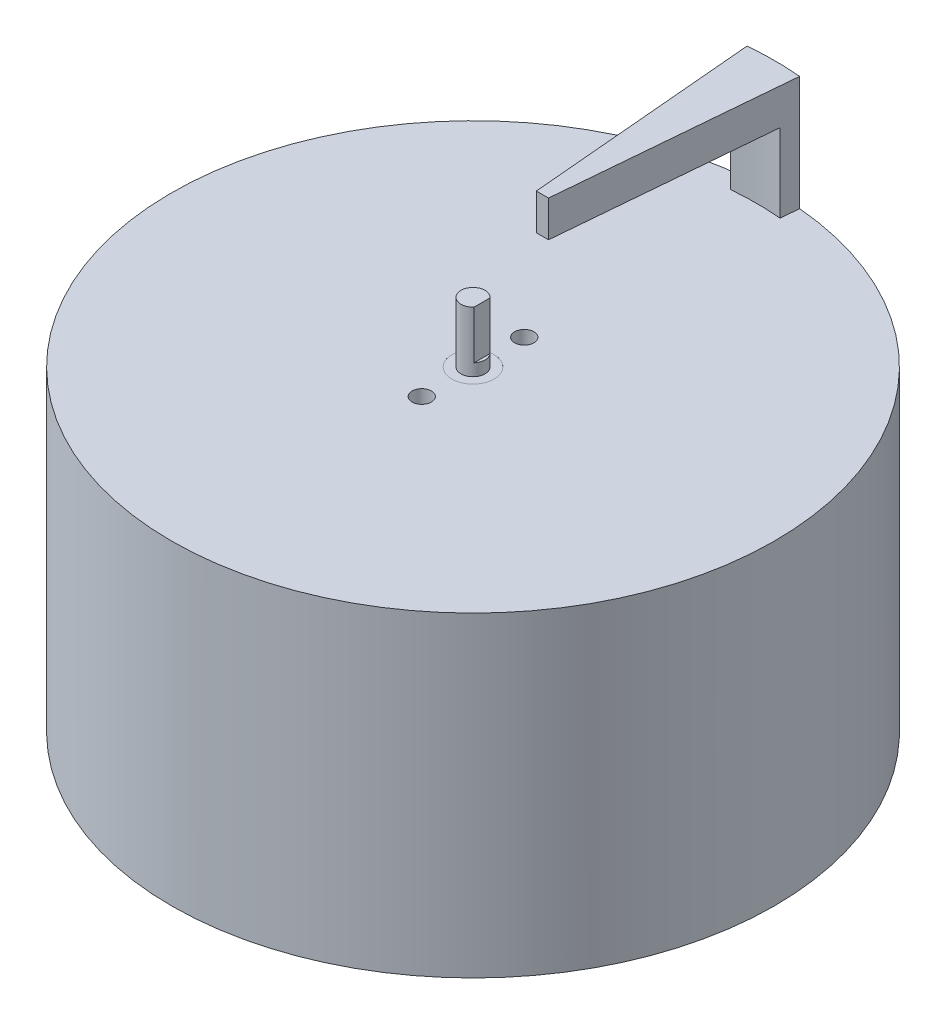
ISO-10303-21;
HEADER;
FILE_DESCRIPTION(('STEP AP214'),'2;1');
FILE_NAME('part.step','',(''),(''),'','','');
FILE_SCHEMA(('AUTOMOTIVE_DESIGN { 1 0 10303 214 1 1 1 1 }'));
ENDSEC;
DATA;
#1=APPLICATION_CONTEXT('core data for automotive mechanical design processes');
#2=APPLICATION_PROTOCOL_DEFINITION('international standard','automotive_design',2000,#1);
#3=PRODUCT_CONTEXT('',#1,'mechanical');
#4=PRODUCT('Part','Part','',(#3));
#5=PRODUCT_RELATED_PRODUCT_CATEGORY('part','',(#4));
#6=PRODUCT_DEFINITION_FORMATION('','',#4);
#7=PRODUCT_DEFINITION_CONTEXT('part definition',#1,'design');
#8=PRODUCT_DEFINITION('design','',#6,#7);
#9=PRODUCT_DEFINITION_SHAPE('','',#8);
#10=(LENGTH_UNIT() NAMED_UNIT(*) SI_UNIT(.MILLI.,.METRE.));
#11=(NAMED_UNIT(*) PLANE_ANGLE_UNIT() SI_UNIT($,.RADIAN.));
#12=(NAMED_UNIT(*) SI_UNIT($,.STERADIAN.) SOLID_ANGLE_UNIT());
#13=UNCERTAINTY_MEASURE_WITH_UNIT(LENGTH_MEASURE(1.E-05),#10,'distance_accuracy_value','');
#14=(GEOMETRIC_REPRESENTATION_CONTEXT(3) GLOBAL_UNCERTAINTY_ASSIGNED_CONTEXT((#13)) GLOBAL_UNIT_ASSIGNED_CONTEXT((#10,
#11,#12)) REPRESENTATION_CONTEXT('',''));
#15=CARTESIAN_POINT('',(0.,0.,0.));
#16=DIRECTION('',(0.,0.,1.));
#17=DIRECTION('',(1.,0.,0.));
#18=AXIS2_PLACEMENT_3D('',#15,#16,#17);
#19=CARTESIAN_POINT('',(-2.14376954204968E-13,61.4,0.));
#20=DIRECTION('',(0.,-1.,0.));
#21=DIRECTION('',(-1.,0.,0.));
#22=AXIS2_PLACEMENT_3D('',#19,#20,#21);
#23=CYLINDRICAL_SURFACE('',#22,47.);
#24=CARTESIAN_POINT('',(-2.03902510188439E-13,58.4,0.));
#25=DIRECTION('',(0.,1.,0.));
#26=DIRECTION('',(1.,0.,0.));
#27=AXIS2_PLACEMENT_3D('',#24,#25,#26);
#28=CIRCLE('',#27,47.);
#29=CARTESIAN_POINT('',(-4.09631990914016,58.4,-46.821150810312));
#30=VERTEX_POINT('',#29);
#31=CARTESIAN_POINT('',(4.09631990913975,58.4,-46.8211508103121));
#32=VERTEX_POINT('',#31);
#33=EDGE_CURVE('P0_E91',#30,#32,#28,.F.);
#34=ORIENTED_EDGE('',*,*,#33,.F.);
#35=DIRECTION('',(0.,-1.,0.));
#36=VECTOR('',#35,1.);
#37=CARTESIAN_POINT('',(-4.09631990914017,61.4,-46.821150810312));
#38=LINE('',#37,#36);
#39=CARTESIAN_POINT('',(-4.09631990914011,45.4,-46.821150810312));
#40=VERTEX_POINT('',#39);
#41=EDGE_CURVE('P0_E31',#30,#40,#38,.T.);
#42=ORIENTED_EDGE('',*,*,#41,.T.);
#43=CARTESIAN_POINT('',(-1.58513252783478E-13,45.4,0.));
#44=DIRECTION('',(0.,1.,0.));
#45=DIRECTION('',(1.,0.,0.));
#46=AXIS2_PLACEMENT_3D('',#43,#44,#45);
#47=CIRCLE('',#46,47.);
#48=CARTESIAN_POINT('',(4.0963199091398,45.4,-46.821150810312));
#49=VERTEX_POINT('',#48);
#50=EDGE_CURVE('P0_E107',#40,#49,#47,.F.);
#51=ORIENTED_EDGE('',*,*,#50,.T.);
#52=DIRECTION('',(0.,-1.,0.));
#53=VECTOR('',#52,1.);
#54=CARTESIAN_POINT('',(4.09631990913974,61.4,-46.821150810312));
#55=LINE('',#54,#53);
#56=EDGE_CURVE('P0_E115',#32,#49,#55,.T.);
#57=ORIENTED_EDGE('',*,*,#56,.F.);
#58=EDGE_LOOP('',(#34,#42,#51,#57));
#59=FACE_BOUND('',#58,.T.);
#60=ADVANCED_FACE('P0_F16',(#59),#23,.F.);
#61=CARTESIAN_POINT('',(-3.50000000000016,45.4,0.));
#62=DIRECTION('',(0.,1.,0.));
#63=DIRECTION('',(-1.,0.,0.));
#64=AXIS2_PLACEMENT_3D('',#61,#62,#63);
#65=PLANE('',#64);
#66=CARTESIAN_POINT('',(-1.58513252783478E-13,45.4,0.));
#67=DIRECTION('',(0.,1.,0.));
#68=DIRECTION('',(1.,0.,0.));
#69=AXIS2_PLACEMENT_3D('',#66,#67,#68);
#70=CIRCLE('',#69,3.5);
#71=CARTESIAN_POINT('',(3.49999999999984,45.4,0.));
#72=VERTEX_POINT('',#71);
#73=EDGE_CURVE('P0_E130',#72,#72,#70,.T.);
#74=ORIENTED_EDGE('',*,*,#73,.F.);
#75=EDGE_LOOP('',(#74));
#76=FACE_BOUND('',#75,.T.);
#77=CARTESIAN_POINT('',(-2.14225111316348E-13,45.4,8.5));
#78=DIRECTION('',(0.,1.,0.));
#79=DIRECTION('',(1.,0.,0.));
#80=AXIS2_PLACEMENT_3D('',#77,#78,#79);
#81=CIRCLE('',#80,1.6);
#82=CARTESIAN_POINT('',(1.59999999999979,45.4,8.5));
#83=VERTEX_POINT('',#82);
#84=EDGE_CURVE('P0_E134',#83,#83,#81,.T.);
#85=ORIENTED_EDGE('',*,*,#84,.F.);
#86=EDGE_LOOP('',(#85));
#87=FACE_BOUND('',#86,.T.);
#88=CARTESIAN_POINT('',(-1.62156577010942E-13,45.4,-8.5));
#89=DIRECTION('',(0.,1.,0.));
#90=DIRECTION('',(1.,0.,0.));
#91=AXIS2_PLACEMENT_3D('',#88,#89,#90);
#92=CIRCLE('',#91,1.6);
#93=CARTESIAN_POINT('',(1.59999999999984,45.4,-8.5));
#94=VERTEX_POINT('',#93);
#95=EDGE_CURVE('P0_E137',#94,#94,#92,.T.);
#96=ORIENTED_EDGE('',*,*,#95,.F.);
#97=EDGE_LOOP('',(#96));
#98=FACE_BOUND('',#97,.T.);
#99=DIRECTION('',(0.0871557427476586,0.,0.996194698091746));
#100=VECTOR('',#99,1.);
#101=CARTESIAN_POINT('',(-1.57649191618767E-13,45.4,0.));
#102=LINE('',#101,#100);
#103=CARTESIAN_POINT('',(-4.35778713738309,45.4,-49.8097349045873));
#104=VERTEX_POINT('',#103);
#105=EDGE_CURVE('P0_E80',#104,#40,#102,.T.);
#106=ORIENTED_EDGE('',*,*,#105,.F.);
#107=CARTESIAN_POINT('',(-1.58513252783478E-13,45.4,0.));
#108=DIRECTION('',(0.,1.,0.));
#109=DIRECTION('',(1.,0.,0.));
#110=AXIS2_PLACEMENT_3D('',#107,#108,#109);
#111=CIRCLE('',#110,50.);
#112=CARTESIAN_POINT('',(4.35778713738277,45.4,-49.8097349045873));
#113=VERTEX_POINT('',#112);
#114=EDGE_CURVE('P0_E24',#104,#113,#111,.T.);
#115=ORIENTED_EDGE('',*,*,#114,.T.);
#116=DIRECTION('',(-0.0871557427476586,0.,0.996194698091746));
#117=VECTOR('',#116,1.);
#118=CARTESIAN_POINT('',(-1.5937731394819E-13,45.4,0.));
#119=LINE('',#118,#117);
#120=EDGE_CURVE('P0_E109',#113,#49,#119,.T.);
#121=ORIENTED_EDGE('',*,*,#120,.T.);
#122=ORIENTED_EDGE('',*,*,#50,.F.);
#123=EDGE_LOOP('',(#106,#115,#121,#122));
#124=FACE_BOUND('',#123,.T.);
#125=ADVANCED_FACE('P0_F152',(#76,#87,#98,#124),#65,.T.);
#126=CARTESIAN_POINT('',(-1.50133697570255E-13,43.,0.));
#127=DIRECTION('',(0.,1.,0.));
#128=DIRECTION('',(1.,0.,0.));
#129=AXIS2_PLACEMENT_3D('',#126,#127,#128);
#130=PLANE('',#129);
#131=CARTESIAN_POINT('',(-2.05845556103125E-13,43.,8.5));
#132=DIRECTION('',(0.,1.,0.));
#133=DIRECTION('',(1.,0.,0.));
#134=AXIS2_PLACEMENT_3D('',#131,#132,#133);
#135=CIRCLE('',#134,1.6);
#136=CARTESIAN_POINT('',(1.59999999999979,43.,8.5));
#137=VERTEX_POINT('',#136);
#138=EDGE_CURVE('P0_E140',#137,#137,#135,.T.);
#139=ORIENTED_EDGE('',*,*,#138,.T.);
#140=EDGE_LOOP('',(#139));
#141=FACE_BOUND('',#140,.T.);
#142=CARTESIAN_POINT('',(-1.53777021797718E-13,43.,-8.5));
#143=DIRECTION('',(0.,1.,0.));
#144=DIRECTION('',(1.,0.,0.));
#145=AXIS2_PLACEMENT_3D('',#142,#143,#144);
#146=CIRCLE('',#145,1.6);
#147=CARTESIAN_POINT('',(1.59999999999985,43.,-8.5));
#148=VERTEX_POINT('',#147);
#149=EDGE_CURVE('P0_E143',#148,#148,#146,.T.);
#150=ORIENTED_EDGE('',*,*,#149,.T.);
#151=EDGE_LOOP('',(#150));
#152=FACE_BOUND('',#151,.T.);
#153=CARTESIAN_POINT('',(-1.50133697570255E-13,43.,0.));
#154=DIRECTION('',(0.,1.,0.));
#155=DIRECTION('',(1.,0.,0.));
#156=AXIS2_PLACEMENT_3D('',#153,#154,#155);
#157=CIRCLE('',#156,3.5);
#158=CARTESIAN_POINT('',(3.49999999999985,43.,0.));
#159=VERTEX_POINT('',#158);
#160=EDGE_CURVE('P0_E133',#159,#159,#157,.T.);
#161=ORIENTED_EDGE('',*,*,#160,.T.);
#162=EDGE_LOOP('',(#161));
#163=FACE_BOUND('',#162,.T.);
#164=CARTESIAN_POINT('',(-1.50133697570255E-13,43.,0.));
#165=DIRECTION('',(0.,1.,0.));
#166=DIRECTION('',(1.,0.,0.));
#167=AXIS2_PLACEMENT_3D('',#164,#165,#166);
#168=CIRCLE('',#167,12.5);
#169=CARTESIAN_POINT('',(12.4999999999998,43.,0.));
#170=VERTEX_POINT('',#169);
#171=EDGE_CURVE('P0_E10',#170,#170,#168,.T.);
#172=ORIENTED_EDGE('',*,*,#171,.F.);
#173=EDGE_LOOP('',(#172));
#174=FACE_BOUND('',#173,.T.);
#175=ADVANCED_FACE('P0_F155',(#141,#152,#163,#174),#130,.F.);
#176=CARTESIAN_POINT('',(-6.55926603227395E-13,186.821356237309,-8.5));
#177=DIRECTION('',(0.,-1.,0.));
#178=DIRECTION('',(-1.,0.,0.));
#179=AXIS2_PLACEMENT_3D('',#176,#177,#178);
#180=CYLINDRICAL_SURFACE('',#179,1.6);
#181=ORIENTED_EDGE('',*,*,#149,.F.);
#182=EDGE_LOOP('',(#181));
#183=FACE_BOUND('',#182,.T.);
#184=ORIENTED_EDGE('',*,*,#95,.T.);
#185=EDGE_LOOP('',(#184));
#186=FACE_BOUND('',#185,.T.);
#187=ADVANCED_FACE('P0_F198',(#183,#186),#180,.F.);
#188=CARTESIAN_POINT('',(-7.07995137532801E-13,186.821356237309,8.5));
#189=DIRECTION('',(0.,-1.,0.));
#190=DIRECTION('',(-1.,0.,0.));
#191=AXIS2_PLACEMENT_3D('',#188,#189,#190);
#192=CYLINDRICAL_SURFACE('',#191,1.6);
#193=ORIENTED_EDGE('',*,*,#138,.F.);
#194=EDGE_LOOP('',(#193));
#195=FACE_BOUND('',#194,.T.);
#196=ORIENTED_EDGE('',*,*,#84,.T.);
#197=EDGE_LOOP('',(#196));
#198=FACE_BOUND('',#197,.T.);
#199=ADVANCED_FACE('P0_F204',(#195,#198),#192,.F.);
#200=CARTESIAN_POINT('',(-6.52283278999931E-13,186.821356237309,0.));
#201=DIRECTION('',(0.,-1.,0.));
#202=DIRECTION('',(-1.,0.,0.));
#203=AXIS2_PLACEMENT_3D('',#200,#201,#202);
#204=CYLINDRICAL_SURFACE('',#203,50.);
#205=DIRECTION('',(0.,-1.,0.));
#206=VECTOR('',#205,1.);
#207=CARTESIAN_POINT('',(4.35778713738272,61.4,-49.8097349045873));
#208=LINE('',#207,#206);
#209=CARTESIAN_POINT('',(4.35778713738271,64.4,-49.8097349045873));
#210=VERTEX_POINT('',#209);
#211=EDGE_CURVE('P0_E113',#210,#113,#208,.T.);
#212=ORIENTED_EDGE('',*,*,#211,.T.);
#213=ORIENTED_EDGE('',*,*,#114,.F.);
#214=DIRECTION('',(0.,-1.,0.));
#215=VECTOR('',#214,1.);
#216=CARTESIAN_POINT('',(-4.35778713738315,61.4,-49.8097349045873));
#217=LINE('',#216,#215);
#218=CARTESIAN_POINT('',(-4.35778713738316,64.4,-49.8097349045873));
#219=VERTEX_POINT('',#218);
#220=EDGE_CURVE('P0_E39',#219,#104,#217,.T.);
#221=ORIENTED_EDGE('',*,*,#220,.F.);
#222=CARTESIAN_POINT('',(-2.24851398221498E-13,64.4,0.));
#223=DIRECTION('',(0.,1.,0.));
#224=DIRECTION('',(1.,0.,0.));
#225=AXIS2_PLACEMENT_3D('',#222,#223,#224);
#226=CIRCLE('',#225,50.);
#227=EDGE_CURVE('P0_E99',#210,#219,#226,.T.);
#228=ORIENTED_EDGE('',*,*,#227,.F.);
#229=EDGE_LOOP('',(#212,#213,#221,#228));
#230=FACE_BOUND('',#229,.T.);
#231=CARTESIAN_POINT('',(0.,-7.00000000000003,0.));
#232=DIRECTION('',(0.,1.,0.));
#233=DIRECTION('',(1.,0.,0.));
#234=AXIS2_PLACEMENT_3D('',#231,#232,#233);
#235=CIRCLE('',#234,50.);
#236=CARTESIAN_POINT('',(50.,-6.99999999999986,0.));
#237=VERTEX_POINT('',#236);
#238=EDGE_CURVE('P0_E121',#237,#237,#235,.T.);
#239=ORIENTED_EDGE('',*,*,#238,.T.);
#240=EDGE_LOOP('',(#239));
#241=FACE_BOUND('',#240,.T.);
#242=ADVANCED_FACE('P0_F18',(#230,#241),#204,.T.);
#243=CARTESIAN_POINT('',(-6.52283278999931E-13,186.821356237309,0.));
#244=DIRECTION('',(0.,-1.,0.));
#245=DIRECTION('',(-1.,0.,0.));
#246=AXIS2_PLACEMENT_3D('',#243,#244,#245);
#247=CYLINDRICAL_SURFACE('',#246,3.5);
#248=ORIENTED_EDGE('',*,*,#160,.F.);
#249=EDGE_LOOP('',(#248));
#250=FACE_BOUND('',#249,.T.);
#251=ORIENTED_EDGE('',*,*,#73,.T.);
#252=EDGE_LOOP('',(#251));
#253=FACE_BOUND('',#252,.T.);
#254=ADVANCED_FACE('P0_F150',(#250,#253),#247,.F.);
#255=CARTESIAN_POINT('',(-1.15218884181823E-13,33.,0.));
#256=DIRECTION('',(0.,1.,0.));
#257=DIRECTION('',(1.,0.,0.));
#258=AXIS2_PLACEMENT_3D('',#255,#256,#257);
#259=CYLINDRICAL_SURFACE('',#258,12.5);
#260=CARTESIAN_POINT('',(-1.15218884181823E-13,33.,0.));
#261=DIRECTION('',(0.,1.,0.));
#262=DIRECTION('',(1.,0.,0.));
#263=AXIS2_PLACEMENT_3D('',#260,#261,#262);
#264=CIRCLE('',#263,12.5);
#265=CARTESIAN_POINT('',(12.4999999999999,33.,0.));
#266=VERTEX_POINT('',#265);
#267=EDGE_CURVE('P0_E124',#266,#266,#264,.T.);
#268=ORIENTED_EDGE('',*,*,#267,.F.);
#269=EDGE_LOOP('',(#268));
#270=FACE_BOUND('',#269,.T.);
#271=ORIENTED_EDGE('',*,*,#171,.T.);
#272=EDGE_LOOP('',(#271));
#273=FACE_BOUND('',#272,.T.);
#274=ADVANCED_FACE('P0_F191',(#270,#273),#259,.F.);
#275=CARTESIAN_POINT('',(-1.15218884181823E-13,33.,0.));
#276=DIRECTION('',(0.,1.,0.));
#277=DIRECTION('',(1.,0.,0.));
#278=AXIS2_PLACEMENT_3D('',#275,#276,#277);
#279=PLANE('',#278);
#280=ORIENTED_EDGE('',*,*,#267,.T.);
#281=EDGE_LOOP('',(#280));
#282=FACE_BOUND('',#281,.T.);
#283=CARTESIAN_POINT('',(-1.15218884181823E-13,33.,0.));
#284=DIRECTION('',(0.,1.,0.));
#285=DIRECTION('',(1.,0.,0.));
#286=AXIS2_PLACEMENT_3D('',#283,#284,#285);
#287=CIRCLE('',#286,17.5);
#288=CARTESIAN_POINT('',(17.4999999999999,33.0000000000001,0.));
#289=VERTEX_POINT('',#288);
#290=EDGE_CURVE('P0_E127',#289,#289,#287,.T.);
#291=ORIENTED_EDGE('',*,*,#290,.F.);
#292=EDGE_LOOP('',(#291));
#293=FACE_BOUND('',#292,.T.);
#294=ADVANCED_FACE('P0_F187',(#282,#293),#279,.F.);
#295=CARTESIAN_POINT('',(0.,-7.00000000000003,0.));
#296=DIRECTION('',(0.,1.,0.));
#297=DIRECTION('',(1.,0.,0.));
#298=AXIS2_PLACEMENT_3D('',#295,#296,#297);
#299=CYLINDRICAL_SURFACE('',#298,17.5);
#300=CARTESIAN_POINT('',(0.,-7.00000000000003,0.));
#301=DIRECTION('',(0.,1.,0.));
#302=DIRECTION('',(1.,0.,0.));
#303=AXIS2_PLACEMENT_3D('',#300,#301,#302);
#304=CIRCLE('',#303,17.5);
#305=CARTESIAN_POINT('',(17.5,-6.99999999999997,0.));
#306=VERTEX_POINT('',#305);
#307=EDGE_CURVE('P0_E118',#306,#306,#304,.T.);
#308=ORIENTED_EDGE('',*,*,#307,.F.);
#309=EDGE_LOOP('',(#308));
#310=FACE_BOUND('',#309,.T.);
#311=ORIENTED_EDGE('',*,*,#290,.T.);
#312=EDGE_LOOP('',(#311));
#313=FACE_BOUND('',#312,.T.);
#314=ADVANCED_FACE('P0_F183',(#310,#313),#299,.F.);
#315=CARTESIAN_POINT('',(0.,-7.00000000000003,0.));
#316=DIRECTION('',(0.,1.,0.));
#317=DIRECTION('',(1.,0.,0.));
#318=AXIS2_PLACEMENT_3D('',#315,#316,#317);
#319=PLANE('',#318);
#320=ORIENTED_EDGE('',*,*,#307,.T.);
#321=EDGE_LOOP('',(#320));
#322=FACE_BOUND('',#321,.T.);
#323=ORIENTED_EDGE('',*,*,#238,.F.);
#324=EDGE_LOOP('',(#323));
#325=FACE_BOUND('',#324,.T.);
#326=ADVANCED_FACE('P0_F180',(#322,#325),#319,.F.);
#327=CARTESIAN_POINT('',(-2.13512893040257E-13,61.4,0.));
#328=DIRECTION('',(0.996194698091746,0.,-0.0871557427476586));
#329=DIRECTION('',(-0.0871557427476586,0.,-0.996194698091746));
#330=AXIS2_PLACEMENT_3D('',#327,#328,#329);
#331=PLANE('',#330);
#332=ORIENTED_EDGE('',*,*,#220,.T.);
#333=ORIENTED_EDGE('',*,*,#105,.T.);
#334=ORIENTED_EDGE('',*,*,#41,.F.);
#335=DIRECTION('',(0.0871557427476586,0.,0.996194698091746));
#336=VECTOR('',#335,1.);
#337=CARTESIAN_POINT('',(-2.03038449023727E-13,58.4,0.));
#338=LINE('',#337,#336);
#339=CARTESIAN_POINT('',(-1.00705543620998,58.4,-11.5106963076579));
#340=VERTEX_POINT('',#339);
#341=EDGE_CURVE('P0_E83',#30,#340,#338,.T.);
#342=ORIENTED_EDGE('',*,*,#341,.T.);
#343=DIRECTION('',(0.,-1.,0.));
#344=VECTOR('',#343,1.);
#345=CARTESIAN_POINT('',(-1.00705543621001,64.4,-11.5106963076579));
#346=LINE('',#345,#344);
#347=CARTESIAN_POINT('',(-1.00705543621001,64.4,-11.5106963076579));
#348=VERTEX_POINT('',#347);
#349=EDGE_CURVE('P0_E73',#348,#340,#346,.T.);
#350=ORIENTED_EDGE('',*,*,#349,.F.);
#351=DIRECTION('',(0.0871557427476586,0.,0.996194698091746));
#352=VECTOR('',#351,1.);
#353=CARTESIAN_POINT('',(-2.23987337056786E-13,64.4,0.));
#354=LINE('',#353,#352);
#355=EDGE_CURVE('P0_E102',#219,#348,#354,.T.);
#356=ORIENTED_EDGE('',*,*,#355,.F.);
#357=EDGE_LOOP('',(#332,#333,#334,#342,#350,#356));
#358=FACE_BOUND('',#357,.T.);
#359=ADVANCED_FACE('P0_F84',(#358),#331,.F.);
#360=CARTESIAN_POINT('',(-2.1524101536968E-13,61.4,0.));
#361=DIRECTION('',(0.996194698091746,0.,0.0871557427476586));
#362=DIRECTION('',(0.0871557427476586,0.,-0.996194698091746));
#363=AXIS2_PLACEMENT_3D('',#360,#361,#362);
#364=PLANE('',#363);
#365=DIRECTION('',(-0.0871557427476586,0.,0.996194698091746));
#366=VECTOR('',#365,1.);
#367=CARTESIAN_POINT('',(-2.04766571353151E-13,58.4,0.));
#368=LINE('',#367,#366);
#369=CARTESIAN_POINT('',(1.00705543620958,58.4,-11.5106963076579));
#370=VERTEX_POINT('',#369);
#371=EDGE_CURVE('P0_E86',#32,#370,#368,.T.);
#372=ORIENTED_EDGE('',*,*,#371,.F.);
#373=ORIENTED_EDGE('',*,*,#56,.T.);
#374=ORIENTED_EDGE('',*,*,#120,.F.);
#375=ORIENTED_EDGE('',*,*,#211,.F.);
#376=DIRECTION('',(-0.0871557427476586,0.,0.996194698091746));
#377=VECTOR('',#376,1.);
#378=CARTESIAN_POINT('',(-2.25715459386209E-13,64.4,0.));
#379=LINE('',#378,#377);
#380=CARTESIAN_POINT('',(1.00705543620956,64.4,-11.5106963076579));
#381=VERTEX_POINT('',#380);
#382=EDGE_CURVE('P0_E93',#210,#381,#379,.T.);
#383=ORIENTED_EDGE('',*,*,#382,.T.);
#384=DIRECTION('',(0.,-1.,0.));
#385=VECTOR('',#384,1.);
#386=CARTESIAN_POINT('',(1.00705543620956,64.4,-11.5106963076579));
#387=LINE('',#386,#385);
#388=EDGE_CURVE('P0_E81',#381,#370,#387,.T.);
#389=ORIENTED_EDGE('',*,*,#388,.T.);
#390=EDGE_LOOP('',(#372,#373,#374,#375,#383,#389));
#391=FACE_BOUND('',#390,.T.);
#392=ADVANCED_FACE('P0_F168',(#391),#364,.T.);
#393=CARTESIAN_POINT('',(-2.24851398221498E-13,64.4,-11.5106963076579));
#394=DIRECTION('',(0.,0.,-1.));
#395=DIRECTION('',(0.,1.,0.));
#396=AXIS2_PLACEMENT_3D('',#393,#394,#395);
#397=PLANE('',#396);
#398=ORIENTED_EDGE('',*,*,#349,.T.);
#399=DIRECTION('',(1.,0.,0.));
#400=VECTOR('',#399,1.);
#401=CARTESIAN_POINT('',(-2.03902510188439E-13,58.4,-11.5106963076579));
#402=LINE('',#401,#400);
#403=EDGE_CURVE('P0_E78',#340,#370,#402,.T.);
#404=ORIENTED_EDGE('',*,*,#403,.T.);
#405=ORIENTED_EDGE('',*,*,#388,.F.);
#406=DIRECTION('',(1.,0.,0.));
#407=VECTOR('',#406,1.);
#408=CARTESIAN_POINT('',(-2.24851398221498E-13,64.4,-11.5106963076579));
#409=LINE('',#408,#407);
#410=EDGE_CURVE('P0_E79',#348,#381,#409,.T.);
#411=ORIENTED_EDGE('',*,*,#410,.F.);
#412=EDGE_LOOP('',(#398,#404,#405,#411));
#413=FACE_BOUND('',#412,.T.);
#414=ADVANCED_FACE('P0_F75',(#413),#397,.F.);
#415=CARTESIAN_POINT('',(-2.24851398221498E-13,64.4,0.));
#416=DIRECTION('',(0.,1.,0.));
#417=DIRECTION('',(1.,0.,0.));
#418=AXIS2_PLACEMENT_3D('',#415,#416,#417);
#419=PLANE('',#418);
#420=ORIENTED_EDGE('',*,*,#382,.F.);
#421=ORIENTED_EDGE('',*,*,#227,.T.);
#422=ORIENTED_EDGE('',*,*,#355,.T.);
#423=ORIENTED_EDGE('',*,*,#410,.T.);
#424=EDGE_LOOP('',(#420,#421,#422,#423));
#425=FACE_BOUND('',#424,.T.);
#426=ADVANCED_FACE('P0_F269',(#425),#419,.T.);
#427=CARTESIAN_POINT('',(-2.03902510188439E-13,58.4,0.));
#428=DIRECTION('',(0.,1.,0.));
#429=DIRECTION('',(1.,0.,0.));
#430=AXIS2_PLACEMENT_3D('',#427,#428,#429);
#431=PLANE('',#430);
#432=ORIENTED_EDGE('',*,*,#341,.F.);
#433=ORIENTED_EDGE('',*,*,#33,.T.);
#434=ORIENTED_EDGE('',*,*,#371,.T.);
#435=ORIENTED_EDGE('',*,*,#403,.F.);
#436=EDGE_LOOP('',(#432,#433,#434,#435));
#437=FACE_BOUND('',#436,.T.);
#438=ADVANCED_FACE('P0_F89',(#437),#431,.F.);
#439=CLOSED_SHELL('',(#60,#125,#175,#187,#199,#242,#254,#274,#294,#314,#326,#359,#392,#414,#426,#438));
#440=MANIFOLD_SOLID_BREP('P0_B1',#439);
#441=CARTESIAN_POINT('',(-2.00000000000019,55.4,0.));
#442=DIRECTION('',(0.,1.,0.));
#443=DIRECTION('',(-1.,0.,0.));
#444=AXIS2_PLACEMENT_3D('',#441,#442,#443);
#445=PLANE('',#444);
#446=DIRECTION('',(0.,0.,1.));
#447=VECTOR('',#446,1.);
#448=CARTESIAN_POINT('',(1.49999999999981,55.4,0.));
#449=LINE('',#448,#447);
#450=CARTESIAN_POINT('',(1.49999999999981,55.4,-1.32287565553229));
#451=VERTEX_POINT('',#450);
#452=CARTESIAN_POINT('',(1.49999999999981,55.4,1.32287565553229));
#453=VERTEX_POINT('',#452);
#454=EDGE_CURVE('P1_E45',#451,#453,#449,.T.);
#455=ORIENTED_EDGE('',*,*,#454,.F.);
#456=CARTESIAN_POINT('',(-1.9342806617191E-13,55.4,0.));
#457=DIRECTION('',(0.,1.,0.));
#458=DIRECTION('',(-1.,0.,0.));
#459=AXIS2_PLACEMENT_3D('',#456,#457,#458);
#460=CIRCLE('',#459,2.);
#461=EDGE_CURVE('P1_E53',#451,#453,#460,.T.);
#462=ORIENTED_EDGE('',*,*,#461,.T.);
#463=EDGE_LOOP('',(#455,#462));
#464=FACE_BOUND('',#463,.T.);
#465=ADVANCED_FACE('P1_F17',(#464),#445,.T.);
#466=CARTESIAN_POINT('',(-12.5,0.,0.));
#467=DIRECTION('',(0.,-1.,0.));
#468=DIRECTION('',(1.,0.,0.));
#469=AXIS2_PLACEMENT_3D('',#466,#467,#468);
#470=PLANE('',#469);
#471=CARTESIAN_POINT('',(0.,0.,0.));
#472=DIRECTION('',(0.,1.,0.));
#473=DIRECTION('',(-1.,0.,0.));
#474=AXIS2_PLACEMENT_3D('',#471,#472,#473);
#475=CIRCLE('',#474,12.5);
#476=CARTESIAN_POINT('',(-12.5,0.,0.));
#477=VERTEX_POINT('',#476);
#478=EDGE_CURVE('P1_E11',#477,#477,#475,.T.);
#479=ORIENTED_EDGE('',*,*,#478,.F.);
#480=EDGE_LOOP('',(#479));
#481=FACE_BOUND('',#480,.T.);
#482=ADVANCED_FACE('P1_F82',(#481),#470,.T.);
#483=CARTESIAN_POINT('',(-1.9342806617191E-13,55.4,0.));
#484=DIRECTION('',(0.,1.,0.));
#485=DIRECTION('',(-1.,0.,0.));
#486=AXIS2_PLACEMENT_3D('',#483,#484,#485);
#487=CYLINDRICAL_SURFACE('',#486,12.5);
#488=ORIENTED_EDGE('',*,*,#478,.T.);
#489=EDGE_LOOP('',(#488));
#490=FACE_BOUND('',#489,.T.);
#491=CARTESIAN_POINT('',(-1.50133697570255E-13,43.,0.));
#492=DIRECTION('',(0.,1.,0.));
#493=DIRECTION('',(-1.,0.,0.));
#494=AXIS2_PLACEMENT_3D('',#491,#492,#493);
#495=CIRCLE('',#494,12.5);
#496=CARTESIAN_POINT('',(-12.5000000000001,43.,0.));
#497=VERTEX_POINT('',#496);
#498=EDGE_CURVE('P1_E24',#497,#497,#495,.T.);
#499=ORIENTED_EDGE('',*,*,#498,.F.);
#500=EDGE_LOOP('',(#499));
#501=FACE_BOUND('',#500,.T.);
#502=ADVANCED_FACE('P1_F80',(#490,#501),#487,.T.);
#503=CARTESIAN_POINT('',(-12.5000000000001,43.,0.));
#504=DIRECTION('',(0.,1.,0.));
#505=DIRECTION('',(-1.,0.,0.));
#506=AXIS2_PLACEMENT_3D('',#503,#504,#505);
#507=PLANE('',#506);
#508=CARTESIAN_POINT('',(-1.53777021797718E-13,43.,-8.5));
#509=DIRECTION('',(0.,1.,0.));
#510=DIRECTION('',(-1.,0.,0.));
#511=AXIS2_PLACEMENT_3D('',#508,#509,#510);
#512=CIRCLE('',#511,1.6);
#513=CARTESIAN_POINT('',(-1.60000000000015,43.,-8.5));
#514=VERTEX_POINT('',#513);
#515=EDGE_CURVE('P1_E64',#514,#514,#512,.T.);
#516=ORIENTED_EDGE('',*,*,#515,.F.);
#517=EDGE_LOOP('',(#516));
#518=FACE_BOUND('',#517,.T.);
#519=CARTESIAN_POINT('',(-2.05845556103125E-13,43.,8.5));
#520=DIRECTION('',(0.,1.,0.));
#521=DIRECTION('',(-1.,0.,0.));
#522=AXIS2_PLACEMENT_3D('',#519,#520,#521);
#523=CIRCLE('',#522,1.6);
#524=CARTESIAN_POINT('',(-1.60000000000021,43.,8.5));
#525=VERTEX_POINT('',#524);
#526=EDGE_CURVE('P1_E67',#525,#525,#523,.T.);
#527=ORIENTED_EDGE('',*,*,#526,.F.);
#528=EDGE_LOOP('',(#527));
#529=FACE_BOUND('',#528,.T.);
#530=ORIENTED_EDGE('',*,*,#498,.T.);
#531=EDGE_LOOP('',(#530));
#532=FACE_BOUND('',#531,.T.);
#533=CARTESIAN_POINT('',(-1.50133697570255E-13,43.,0.));
#534=DIRECTION('',(0.,1.,0.));
#535=DIRECTION('',(-1.,0.,0.));
#536=AXIS2_PLACEMENT_3D('',#533,#534,#535);
#537=CIRCLE('',#536,3.5);
#538=CARTESIAN_POINT('',(-3.50000000000015,43.,0.));
#539=VERTEX_POINT('',#538);
#540=EDGE_CURVE('P1_E72',#539,#539,#537,.T.);
#541=ORIENTED_EDGE('',*,*,#540,.F.);
#542=EDGE_LOOP('',(#541));
#543=FACE_BOUND('',#542,.T.);
#544=ADVANCED_FACE('P1_F77',(#518,#529,#532,#543),#507,.T.);
#545=CARTESIAN_POINT('',(-1.9342806617191E-13,55.4,0.));
#546=DIRECTION('',(0.,1.,0.));
#547=DIRECTION('',(-1.,0.,0.));
#548=AXIS2_PLACEMENT_3D('',#545,#546,#547);
#549=CYLINDRICAL_SURFACE('',#548,3.5);
#550=ORIENTED_EDGE('',*,*,#540,.T.);
#551=EDGE_LOOP('',(#550));
#552=FACE_BOUND('',#551,.T.);
#553=CARTESIAN_POINT('',(-1.58513252783478E-13,45.4,0.));
#554=DIRECTION('',(0.,1.,0.));
#555=DIRECTION('',(-1.,0.,0.));
#556=AXIS2_PLACEMENT_3D('',#553,#554,#555);
#557=CIRCLE('',#556,3.5);
#558=CARTESIAN_POINT('',(-3.50000000000016,45.4,0.));
#559=VERTEX_POINT('',#558);
#560=EDGE_CURVE('P1_E61',#559,#559,#557,.T.);
#561=ORIENTED_EDGE('',*,*,#560,.F.);
#562=EDGE_LOOP('',(#561));
#563=FACE_BOUND('',#562,.T.);
#564=ADVANCED_FACE('P1_F91',(#552,#563),#549,.T.);
#565=CARTESIAN_POINT('',(-3.50000000000016,45.4,0.));
#566=DIRECTION('',(0.,1.,0.));
#567=DIRECTION('',(-1.,0.,0.));
#568=AXIS2_PLACEMENT_3D('',#565,#566,#567);
#569=PLANE('',#568);
#570=ORIENTED_EDGE('',*,*,#560,.T.);
#571=EDGE_LOOP('',(#570));
#572=FACE_BOUND('',#571,.T.);
#573=CARTESIAN_POINT('',(-1.58513252783478E-13,45.4,0.));
#574=DIRECTION('',(0.,1.,0.));
#575=DIRECTION('',(-1.,0.,0.));
#576=AXIS2_PLACEMENT_3D('',#573,#574,#575);
#577=CIRCLE('',#576,2.);
#578=CARTESIAN_POINT('',(-2.00000000000016,45.4,0.));
#579=VERTEX_POINT('',#578);
#580=EDGE_CURVE('P1_E57',#579,#579,#577,.T.);
#581=ORIENTED_EDGE('',*,*,#580,.F.);
#582=EDGE_LOOP('',(#581));
#583=FACE_BOUND('',#582,.T.);
#584=ADVANCED_FACE('P1_F127',(#572,#583),#569,.T.);
#585=CARTESIAN_POINT('',(-1.9342806617191E-13,55.4,0.));
#586=DIRECTION('',(0.,1.,0.));
#587=DIRECTION('',(-1.,0.,0.));
#588=AXIS2_PLACEMENT_3D('',#585,#586,#587);
#589=CYLINDRICAL_SURFACE('',#588,2.);
#590=DIRECTION('',(0.,1.,0.));
#591=VECTOR('',#590,1.);
#592=CARTESIAN_POINT('',(1.49999999999983,47.4,1.32287565553229));
#593=LINE('',#592,#591);
#594=CARTESIAN_POINT('',(1.49999999999983,47.4,1.32287565553229));
#595=VERTEX_POINT('',#594);
#596=EDGE_CURVE('P1_E49',#595,#453,#593,.T.);
#597=ORIENTED_EDGE('',*,*,#596,.T.);
#598=ORIENTED_EDGE('',*,*,#461,.F.);
#599=DIRECTION('',(0.,1.,0.));
#600=VECTOR('',#599,1.);
#601=CARTESIAN_POINT('',(1.49999999999983,47.4,-1.32287565553229));
#602=LINE('',#601,#600);
#603=CARTESIAN_POINT('',(1.49999999999983,47.4,-1.32287565553229));
#604=VERTEX_POINT('',#603);
#605=EDGE_CURVE('P1_E42',#604,#451,#602,.T.);
#606=ORIENTED_EDGE('',*,*,#605,.F.);
#607=CARTESIAN_POINT('',(-1.65496215461164E-13,47.4,0.));
#608=DIRECTION('',(0.,1.,0.));
#609=DIRECTION('',(-1.,0.,0.));
#610=AXIS2_PLACEMENT_3D('',#607,#608,#609);
#611=CIRCLE('',#610,2.);
#612=EDGE_CURVE('P1_E35',#595,#604,#611,.T.);
#613=ORIENTED_EDGE('',*,*,#612,.F.);
#614=EDGE_LOOP('',(#597,#598,#606,#613));
#615=FACE_BOUND('',#614,.T.);
#616=ORIENTED_EDGE('',*,*,#580,.T.);
#617=EDGE_LOOP('',(#616));
#618=FACE_BOUND('',#617,.T.);
#619=ADVANCED_FACE('P1_F55',(#615,#618),#589,.T.);
#620=CARTESIAN_POINT('',(-1.88388149408909E-13,38.,8.5));
#621=DIRECTION('',(0.,1.,0.));
#622=DIRECTION('',(-1.,0.,0.));
#623=AXIS2_PLACEMENT_3D('',#620,#621,#622);
#624=CYLINDRICAL_SURFACE('',#623,1.6);
#625=CARTESIAN_POINT('',(-1.88388149408909E-13,38.,8.5));
#626=DIRECTION('',(0.,1.,0.));
#627=DIRECTION('',(-1.,0.,0.));
#628=AXIS2_PLACEMENT_3D('',#625,#626,#627);
#629=CIRCLE('',#628,1.6);
#630=CARTESIAN_POINT('',(-1.60000000000019,38.,8.5));
#631=VERTEX_POINT('',#630);
#632=EDGE_CURVE('P1_E212',#631,#631,#629,.T.);
#633=ORIENTED_EDGE('',*,*,#632,.F.);
#634=EDGE_LOOP('',(#633));
#635=FACE_BOUND('',#634,.T.);
#636=ORIENTED_EDGE('',*,*,#526,.T.);
#637=EDGE_LOOP('',(#636));
#638=FACE_BOUND('',#637,.T.);
#639=ADVANCED_FACE('P1_F147',(#635,#638),#624,.F.);
#640=CARTESIAN_POINT('',(-1.33664132112238E-13,38.,0.));
#641=DIRECTION('',(0.,1.,0.));
#642=DIRECTION('',(-1.,0.,0.));
#643=AXIS2_PLACEMENT_3D('',#640,#641,#642);
#644=PLANE('',#643);
#645=ORIENTED_EDGE('',*,*,#632,.T.);
#646=EDGE_LOOP('',(#645));
#647=FACE_BOUND('',#646,.T.);
#648=ADVANCED_FACE('P1_F156',(#647),#644,.T.);
#649=CARTESIAN_POINT('',(-1.36319615103502E-13,38.,-8.5));
#650=DIRECTION('',(0.,1.,0.));
#651=DIRECTION('',(-1.,0.,0.));
#652=AXIS2_PLACEMENT_3D('',#649,#650,#651);
#653=CYLINDRICAL_SURFACE('',#652,1.6);
#654=CARTESIAN_POINT('',(-1.36319615103502E-13,38.,-8.5));
#655=DIRECTION('',(0.,1.,0.));
#656=DIRECTION('',(-1.,0.,0.));
#657=AXIS2_PLACEMENT_3D('',#654,#655,#656);
#658=CIRCLE('',#657,1.6);
#659=CARTESIAN_POINT('',(-1.60000000000014,38.,-8.5));
#660=VERTEX_POINT('',#659);
#661=EDGE_CURVE('P1_E58',#660,#660,#658,.T.);
#662=ORIENTED_EDGE('',*,*,#661,.F.);
#663=EDGE_LOOP('',(#662));
#664=FACE_BOUND('',#663,.T.);
#665=ORIENTED_EDGE('',*,*,#515,.T.);
#666=EDGE_LOOP('',(#665));
#667=FACE_BOUND('',#666,.T.);
#668=ADVANCED_FACE('P1_F166',(#664,#667),#653,.F.);
#669=CARTESIAN_POINT('',(-1.33664132112238E-13,38.,0.));
#670=DIRECTION('',(0.,1.,0.));
#671=DIRECTION('',(-1.,0.,0.));
#672=AXIS2_PLACEMENT_3D('',#669,#670,#671);
#673=PLANE('',#672);
#674=ORIENTED_EDGE('',*,*,#661,.T.);
#675=EDGE_LOOP('',(#674));
#676=FACE_BOUND('',#675,.T.);
#677=ADVANCED_FACE('P1_F176',(#676),#673,.T.);
#678=CARTESIAN_POINT('',(1.49999999999983,47.4,0.));
#679=DIRECTION('',(-1.,0.,0.));
#680=DIRECTION('',(0.,-1.,0.));
#681=AXIS2_PLACEMENT_3D('',#678,#679,#680);
#682=PLANE('',#681);
#683=ORIENTED_EDGE('',*,*,#454,.T.);
#684=ORIENTED_EDGE('',*,*,#596,.F.);
#685=DIRECTION('',(0.,0.,1.));
#686=VECTOR('',#685,1.);
#687=CARTESIAN_POINT('',(1.49999999999983,47.4,0.));
#688=LINE('',#687,#686);
#689=EDGE_CURVE('P1_E30',#604,#595,#688,.T.);
#690=ORIENTED_EDGE('',*,*,#689,.F.);
#691=ORIENTED_EDGE('',*,*,#605,.T.);
#692=EDGE_LOOP('',(#683,#684,#690,#691));
#693=FACE_BOUND('',#692,.T.);
#694=ADVANCED_FACE('P1_F44',(#693),#682,.F.);
#695=CARTESIAN_POINT('',(-1.41360840771623E-13,47.4,0.));
#696=DIRECTION('',(0.,1.,0.));
#697=DIRECTION('',(-1.,0.,0.));
#698=AXIS2_PLACEMENT_3D('',#695,#696,#697);
#699=PLANE('',#698);
#700=ORIENTED_EDGE('',*,*,#612,.T.);
#701=ORIENTED_EDGE('',*,*,#689,.T.);
#702=EDGE_LOOP('',(#700,#701));
#703=FACE_BOUND('',#702,.T.);
#704=ADVANCED_FACE('P1_F195',(#703),#699,.T.);
#705=CLOSED_SHELL('',(#465,#482,#502,#544,#564,#584,#619,#639,#648,#668,#677,#694,#704));
#706=MANIFOLD_SOLID_BREP('P1_B1',#705);
#707=ADVANCED_BREP_SHAPE_REPRESENTATION('',(#18,#440,#706),#14);
#708=SHAPE_DEFINITION_REPRESENTATION(#9,#707);
ENDSEC;
END-ISO-10303-21;
